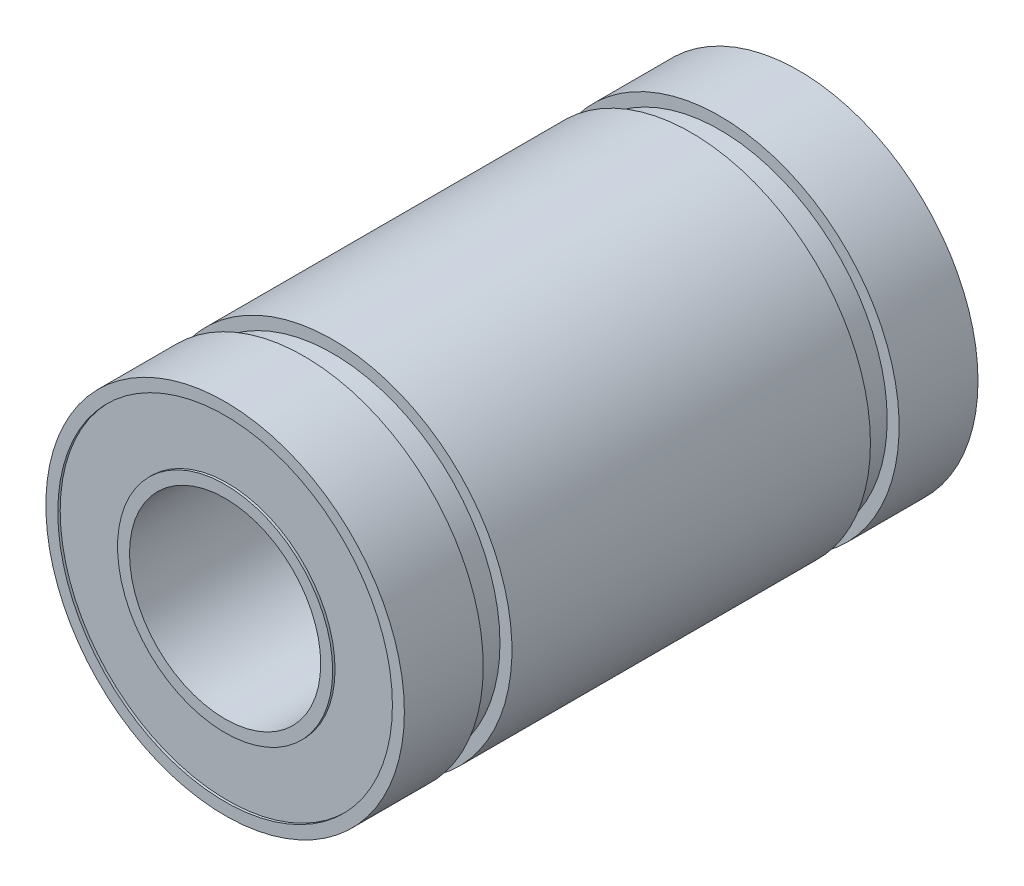
ISO-10303-21;
HEADER;
FILE_DESCRIPTION(('STEP AP214'),'2;1');
FILE_NAME('part.step','',(''),(''),'','','');
FILE_SCHEMA(('AUTOMOTIVE_DESIGN { 1 0 10303 214 1 1 1 1 }'));
ENDSEC;
DATA;
#1=APPLICATION_CONTEXT('core data for automotive mechanical design processes');
#2=APPLICATION_PROTOCOL_DEFINITION('international standard','automotive_design',2000,#1);
#3=PRODUCT_CONTEXT('',#1,'mechanical');
#4=PRODUCT('Part','Part','',(#3));
#5=PRODUCT_RELATED_PRODUCT_CATEGORY('part','',(#4));
#6=PRODUCT_DEFINITION_FORMATION('','',#4);
#7=PRODUCT_DEFINITION_CONTEXT('part definition',#1,'design');
#8=PRODUCT_DEFINITION('design','',#6,#7);
#9=PRODUCT_DEFINITION_SHAPE('','',#8);
#10=(LENGTH_UNIT() NAMED_UNIT(*) SI_UNIT(.MILLI.,.METRE.));
#11=(NAMED_UNIT(*) PLANE_ANGLE_UNIT() SI_UNIT($,.RADIAN.));
#12=(NAMED_UNIT(*) SI_UNIT($,.STERADIAN.) SOLID_ANGLE_UNIT());
#13=UNCERTAINTY_MEASURE_WITH_UNIT(LENGTH_MEASURE(1.E-05),#10,'distance_accuracy_value','');
#14=(GEOMETRIC_REPRESENTATION_CONTEXT(3) GLOBAL_UNCERTAINTY_ASSIGNED_CONTEXT((#13)) GLOBAL_UNIT_ASSIGNED_CONTEXT((#10,
#11,#12)) REPRESENTATION_CONTEXT('',''));
#15=CARTESIAN_POINT('',(0.,0.,0.));
#16=DIRECTION('',(0.,0.,1.));
#17=DIRECTION('',(1.,0.,0.));
#18=AXIS2_PLACEMENT_3D('',#15,#16,#17);
#19=CARTESIAN_POINT('',(0.,0.,12.));
#20=DIRECTION('',(0.,0.,-1.));
#21=DIRECTION('',(-1.,0.,0.));
#22=AXIS2_PLACEMENT_3D('',#19,#20,#21);
#23=CYLINDRICAL_SURFACE('',#22,7.5);
#24=CARTESIAN_POINT('',(0.,0.,-8.7));
#25=DIRECTION('',(0.,0.,-1.));
#26=DIRECTION('',(-1.,0.,0.));
#27=AXIS2_PLACEMENT_3D('',#24,#25,#26);
#28=CIRCLE('',#27,7.5);
#29=CARTESIAN_POINT('',(-7.5,0.,-8.7));
#30=VERTEX_POINT('',#29);
#31=EDGE_CURVE('E41',#30,#30,#28,.T.);
#32=ORIENTED_EDGE('',*,*,#31,.T.);
#33=EDGE_LOOP('',(#32));
#34=FACE_BOUND('',#33,.T.);
#35=CARTESIAN_POINT('',(0.,0.,-12.));
#36=DIRECTION('',(0.,0.,1.));
#37=DIRECTION('',(1.,0.,0.));
#38=AXIS2_PLACEMENT_3D('',#35,#36,#37);
#39=CIRCLE('',#38,7.5);
#40=CARTESIAN_POINT('',(7.5,0.,-12.));
#41=VERTEX_POINT('',#40);
#42=EDGE_CURVE('E45',#41,#41,#39,.T.);
#43=ORIENTED_EDGE('',*,*,#42,.T.);
#44=EDGE_LOOP('',(#43));
#45=FACE_BOUND('',#44,.T.);
#46=ADVANCED_FACE('F37',(#34,#45),#23,.T.);
#47=CARTESIAN_POINT('',(0.,0.,-7.5));
#48=DIRECTION('',(0.,0.,1.));
#49=DIRECTION('',(1.,0.,0.));
#50=AXIS2_PLACEMENT_3D('',#47,#48,#49);
#51=CIRCLE('',#50,7.5);
#52=CARTESIAN_POINT('',(7.5,0.,-7.5));
#53=VERTEX_POINT('',#52);
#54=EDGE_CURVE('E63',#53,#53,#51,.T.);
#55=ORIENTED_EDGE('',*,*,#54,.T.);
#56=EDGE_LOOP('',(#55));
#57=FACE_BOUND('',#56,.T.);
#58=CARTESIAN_POINT('',(0.,0.,7.5));
#59=DIRECTION('',(0.,0.,-1.));
#60=DIRECTION('',(-1.,0.,0.));
#61=AXIS2_PLACEMENT_3D('',#58,#59,#60);
#62=CIRCLE('',#61,7.5);
#63=CARTESIAN_POINT('',(-7.5,0.,7.5));
#64=VERTEX_POINT('',#63);
#65=EDGE_CURVE('E59',#64,#64,#62,.T.);
#66=ORIENTED_EDGE('',*,*,#65,.T.);
#67=EDGE_LOOP('',(#66));
#68=FACE_BOUND('',#67,.T.);
#69=ADVANCED_FACE('F124',(#57,#68),#23,.T.);
#70=CARTESIAN_POINT('',(0.,0.,-12.));
#71=DIRECTION('',(0.,0.,1.));
#72=DIRECTION('',(1.,0.,0.));
#73=AXIS2_PLACEMENT_3D('',#70,#71,#72);
#74=PLANE('',#73);
#75=ORIENTED_EDGE('',*,*,#42,.F.);
#76=EDGE_LOOP('',(#75));
#77=FACE_BOUND('',#76,.T.);
#78=CARTESIAN_POINT('',(0.,0.,-12.));
#79=DIRECTION('',(0.,0.,1.));
#80=DIRECTION('',(1.,0.,0.));
#81=AXIS2_PLACEMENT_3D('',#78,#79,#80);
#82=CIRCLE('',#81,7.);
#83=CARTESIAN_POINT('',(7.,0.,-12.));
#84=VERTEX_POINT('',#83);
#85=EDGE_CURVE('E85',#84,#84,#82,.T.);
#86=ORIENTED_EDGE('',*,*,#85,.T.);
#87=EDGE_LOOP('',(#86));
#88=FACE_BOUND('',#87,.T.);
#89=ADVANCED_FACE('F131',(#77,#88),#74,.F.);
#90=CARTESIAN_POINT('',(0.,0.,12.));
#91=DIRECTION('',(0.,0.,1.));
#92=DIRECTION('',(1.,0.,0.));
#93=AXIS2_PLACEMENT_3D('',#90,#91,#92);
#94=PLANE('',#93);
#95=CARTESIAN_POINT('',(0.,0.,12.));
#96=DIRECTION('',(0.,0.,1.));
#97=DIRECTION('',(1.,0.,0.));
#98=AXIS2_PLACEMENT_3D('',#95,#96,#97);
#99=CIRCLE('',#98,4.);
#100=CARTESIAN_POINT('',(4.,0.,12.));
#101=VERTEX_POINT('',#100);
#102=EDGE_CURVE('E50',#101,#101,#99,.T.);
#103=ORIENTED_EDGE('',*,*,#102,.F.);
#104=EDGE_LOOP('',(#103));
#105=FACE_BOUND('',#104,.T.);
#106=CARTESIAN_POINT('',(0.,0.,12.));
#107=DIRECTION('',(0.,0.,1.));
#108=DIRECTION('',(1.,0.,0.));
#109=AXIS2_PLACEMENT_3D('',#106,#107,#108);
#110=CIRCLE('',#109,4.5);
#111=CARTESIAN_POINT('',(4.5,0.,12.));
#112=VERTEX_POINT('',#111);
#113=EDGE_CURVE('E91',#112,#112,#110,.T.);
#114=ORIENTED_EDGE('',*,*,#113,.T.);
#115=EDGE_LOOP('',(#114));
#116=FACE_BOUND('',#115,.T.);
#117=ADVANCED_FACE('F138',(#105,#116),#94,.T.);
#118=CARTESIAN_POINT('',(0.,0.,12.));
#119=DIRECTION('',(0.,0.,1.));
#120=DIRECTION('',(1.,0.,0.));
#121=AXIS2_PLACEMENT_3D('',#118,#119,#120);
#122=CIRCLE('',#121,7.);
#123=CARTESIAN_POINT('',(7.,0.,12.));
#124=VERTEX_POINT('',#123);
#125=EDGE_CURVE('E97',#124,#124,#122,.T.);
#126=ORIENTED_EDGE('',*,*,#125,.F.);
#127=EDGE_LOOP('',(#126));
#128=FACE_BOUND('',#127,.T.);
#129=CARTESIAN_POINT('',(0.,0.,12.));
#130=DIRECTION('',(0.,0.,1.));
#131=DIRECTION('',(1.,0.,0.));
#132=AXIS2_PLACEMENT_3D('',#129,#130,#131);
#133=CIRCLE('',#132,7.5);
#134=CARTESIAN_POINT('',(7.5,0.,12.));
#135=VERTEX_POINT('',#134);
#136=EDGE_CURVE('E10',#135,#135,#133,.T.);
#137=ORIENTED_EDGE('',*,*,#136,.T.);
#138=EDGE_LOOP('',(#137));
#139=FACE_BOUND('',#138,.T.);
#140=ADVANCED_FACE('F171',(#128,#139),#94,.T.);
#141=CARTESIAN_POINT('',(0.,0.,-12.));
#142=DIRECTION('',(0.,0.,1.));
#143=DIRECTION('',(1.,0.,0.));
#144=AXIS2_PLACEMENT_3D('',#141,#142,#143);
#145=CIRCLE('',#144,4.5);
#146=CARTESIAN_POINT('',(4.5,0.,-12.));
#147=VERTEX_POINT('',#146);
#148=EDGE_CURVE('E62',#147,#147,#145,.T.);
#149=ORIENTED_EDGE('',*,*,#148,.F.);
#150=EDGE_LOOP('',(#149));
#151=FACE_BOUND('',#150,.T.);
#152=CARTESIAN_POINT('',(0.,0.,-12.));
#153=DIRECTION('',(0.,0.,1.));
#154=DIRECTION('',(1.,0.,0.));
#155=AXIS2_PLACEMENT_3D('',#152,#153,#154);
#156=CIRCLE('',#155,4.);
#157=CARTESIAN_POINT('',(4.,0.,-12.));
#158=VERTEX_POINT('',#157);
#159=EDGE_CURVE('E53',#158,#158,#156,.T.);
#160=ORIENTED_EDGE('',*,*,#159,.T.);
#161=EDGE_LOOP('',(#160));
#162=FACE_BOUND('',#161,.T.);
#163=ADVANCED_FACE('F110',(#151,#162),#74,.F.);
#164=CARTESIAN_POINT('',(0.,0.,8.7));
#165=DIRECTION('',(0.,0.,1.));
#166=DIRECTION('',(1.,0.,0.));
#167=AXIS2_PLACEMENT_3D('',#164,#165,#166);
#168=CIRCLE('',#167,7.5);
#169=CARTESIAN_POINT('',(7.5,0.,8.7));
#170=VERTEX_POINT('',#169);
#171=EDGE_CURVE('E56',#170,#170,#168,.T.);
#172=ORIENTED_EDGE('',*,*,#171,.T.);
#173=EDGE_LOOP('',(#172));
#174=FACE_BOUND('',#173,.T.);
#175=ORIENTED_EDGE('',*,*,#136,.F.);
#176=EDGE_LOOP('',(#175));
#177=FACE_BOUND('',#176,.T.);
#178=ADVANCED_FACE('F39',(#174,#177),#23,.T.);
#179=CARTESIAN_POINT('',(0.,0.,12.));
#180=DIRECTION('',(0.,0.,-1.));
#181=DIRECTION('',(-1.,0.,0.));
#182=AXIS2_PLACEMENT_3D('',#179,#180,#181);
#183=CYLINDRICAL_SURFACE('',#182,4.);
#184=ORIENTED_EDGE('',*,*,#102,.T.);
#185=EDGE_LOOP('',(#184));
#186=FACE_BOUND('',#185,.T.);
#187=ORIENTED_EDGE('',*,*,#159,.F.);
#188=EDGE_LOOP('',(#187));
#189=FACE_BOUND('',#188,.T.);
#190=ADVANCED_FACE('F112',(#186,#189),#183,.F.);
#191=CARTESIAN_POINT('',(0.,0.,11.9));
#192=DIRECTION('',(0.,0.,1.));
#193=DIRECTION('',(1.,0.,0.));
#194=AXIS2_PLACEMENT_3D('',#191,#192,#193);
#195=CYLINDRICAL_SURFACE('',#194,7.);
#196=CARTESIAN_POINT('',(0.,0.,11.9));
#197=DIRECTION('',(0.,0.,1.));
#198=DIRECTION('',(1.,0.,0.));
#199=AXIS2_PLACEMENT_3D('',#196,#197,#198);
#200=CIRCLE('',#199,7.);
#201=CARTESIAN_POINT('',(7.,0.,11.9));
#202=VERTEX_POINT('',#201);
#203=EDGE_CURVE('E100',#202,#202,#200,.T.);
#204=ORIENTED_EDGE('',*,*,#203,.F.);
#205=EDGE_LOOP('',(#204));
#206=FACE_BOUND('',#205,.T.);
#207=ORIENTED_EDGE('',*,*,#125,.T.);
#208=EDGE_LOOP('',(#207));
#209=FACE_BOUND('',#208,.T.);
#210=ADVANCED_FACE('F114',(#206,#209),#195,.F.);
#211=CARTESIAN_POINT('',(0.,0.,11.9));
#212=DIRECTION('',(0.,0.,1.));
#213=DIRECTION('',(1.,0.,0.));
#214=AXIS2_PLACEMENT_3D('',#211,#212,#213);
#215=PLANE('',#214);
#216=CARTESIAN_POINT('',(0.,0.,11.9));
#217=DIRECTION('',(0.,0.,1.));
#218=DIRECTION('',(1.,0.,0.));
#219=AXIS2_PLACEMENT_3D('',#216,#217,#218);
#220=CIRCLE('',#219,4.5);
#221=CARTESIAN_POINT('',(4.5,0.,11.9));
#222=VERTEX_POINT('',#221);
#223=EDGE_CURVE('E94',#222,#222,#220,.T.);
#224=ORIENTED_EDGE('',*,*,#223,.F.);
#225=EDGE_LOOP('',(#224));
#226=FACE_BOUND('',#225,.T.);
#227=ORIENTED_EDGE('',*,*,#203,.T.);
#228=EDGE_LOOP('',(#227));
#229=FACE_BOUND('',#228,.T.);
#230=ADVANCED_FACE('F120',(#226,#229),#215,.T.);
#231=CARTESIAN_POINT('',(0.,0.,11.9));
#232=DIRECTION('',(0.,0.,1.));
#233=DIRECTION('',(1.,0.,0.));
#234=AXIS2_PLACEMENT_3D('',#231,#232,#233);
#235=CYLINDRICAL_SURFACE('',#234,4.5);
#236=ORIENTED_EDGE('',*,*,#223,.T.);
#237=EDGE_LOOP('',(#236));
#238=FACE_BOUND('',#237,.T.);
#239=ORIENTED_EDGE('',*,*,#113,.F.);
#240=EDGE_LOOP('',(#239));
#241=FACE_BOUND('',#240,.T.);
#242=ADVANCED_FACE('F154',(#238,#241),#235,.T.);
#243=CARTESIAN_POINT('',(0.,0.,-11.9));
#244=DIRECTION('',(0.,0.,-1.));
#245=DIRECTION('',(1.,0.,0.));
#246=AXIS2_PLACEMENT_3D('',#243,#244,#245);
#247=PLANE('',#246);
#248=CARTESIAN_POINT('',(0.,0.,-11.9));
#249=DIRECTION('',(0.,0.,1.));
#250=DIRECTION('',(1.,0.,0.));
#251=AXIS2_PLACEMENT_3D('',#248,#249,#250);
#252=CIRCLE('',#251,7.);
#253=CARTESIAN_POINT('',(7.,0.,-11.9));
#254=VERTEX_POINT('',#253);
#255=EDGE_CURVE('E88',#254,#254,#252,.T.);
#256=ORIENTED_EDGE('',*,*,#255,.F.);
#257=EDGE_LOOP('',(#256));
#258=FACE_BOUND('',#257,.T.);
#259=CARTESIAN_POINT('',(0.,0.,-11.9));
#260=DIRECTION('',(0.,0.,1.));
#261=DIRECTION('',(1.,0.,0.));
#262=AXIS2_PLACEMENT_3D('',#259,#260,#261);
#263=CIRCLE('',#262,4.5);
#264=CARTESIAN_POINT('',(4.5,0.,-11.9));
#265=VERTEX_POINT('',#264);
#266=EDGE_CURVE('E82',#265,#265,#263,.T.);
#267=ORIENTED_EDGE('',*,*,#266,.T.);
#268=EDGE_LOOP('',(#267));
#269=FACE_BOUND('',#268,.T.);
#270=ADVANCED_FACE('F144',(#258,#269),#247,.T.);
#271=CARTESIAN_POINT('',(0.,0.,-11.9));
#272=DIRECTION('',(0.,0.,-1.));
#273=DIRECTION('',(-1.,0.,0.));
#274=AXIS2_PLACEMENT_3D('',#271,#272,#273);
#275=CYLINDRICAL_SURFACE('',#274,7.);
#276=ORIENTED_EDGE('',*,*,#255,.T.);
#277=EDGE_LOOP('',(#276));
#278=FACE_BOUND('',#277,.T.);
#279=ORIENTED_EDGE('',*,*,#85,.F.);
#280=EDGE_LOOP('',(#279));
#281=FACE_BOUND('',#280,.T.);
#282=ADVANCED_FACE('F141',(#278,#281),#275,.F.);
#283=CARTESIAN_POINT('',(0.,0.,-11.9));
#284=DIRECTION('',(0.,0.,-1.));
#285=DIRECTION('',(-1.,0.,0.));
#286=AXIS2_PLACEMENT_3D('',#283,#284,#285);
#287=CYLINDRICAL_SURFACE('',#286,4.5);
#288=ORIENTED_EDGE('',*,*,#266,.F.);
#289=EDGE_LOOP('',(#288));
#290=FACE_BOUND('',#289,.T.);
#291=ORIENTED_EDGE('',*,*,#148,.T.);
#292=EDGE_LOOP('',(#291));
#293=FACE_BOUND('',#292,.T.);
#294=ADVANCED_FACE('F143',(#290,#293),#287,.T.);
#295=CARTESIAN_POINT('',(0.,8.,7.5));
#296=DIRECTION('',(0.,0.,-1.));
#297=DIRECTION('',(-1.,0.,0.));
#298=AXIS2_PLACEMENT_3D('',#295,#296,#297);
#299=PLANE('',#298);
#300=CARTESIAN_POINT('',(0.,0.,7.5));
#301=DIRECTION('',(0.,0.,-1.));
#302=DIRECTION('',(-1.,0.,0.));
#303=AXIS2_PLACEMENT_3D('',#300,#301,#302);
#304=CIRCLE('',#303,7.);
#305=CARTESIAN_POINT('',(-7.,0.,7.5));
#306=VERTEX_POINT('',#305);
#307=EDGE_CURVE('E69',#306,#306,#304,.T.);
#308=ORIENTED_EDGE('',*,*,#307,.T.);
#309=EDGE_LOOP('',(#308));
#310=FACE_BOUND('',#309,.T.);
#311=ORIENTED_EDGE('',*,*,#65,.F.);
#312=EDGE_LOOP('',(#311));
#313=FACE_BOUND('',#312,.T.);
#314=ADVANCED_FACE('F151',(#310,#313),#299,.F.);
#315=CARTESIAN_POINT('',(0.,8.,8.7));
#316=DIRECTION('',(0.,0.,1.));
#317=DIRECTION('',(1.,0.,0.));
#318=AXIS2_PLACEMENT_3D('',#315,#316,#317);
#319=PLANE('',#318);
#320=CARTESIAN_POINT('',(0.,0.,8.7));
#321=DIRECTION('',(0.,0.,-1.));
#322=DIRECTION('',(-1.,0.,0.));
#323=AXIS2_PLACEMENT_3D('',#320,#321,#322);
#324=CIRCLE('',#323,7.);
#325=CARTESIAN_POINT('',(-7.,0.,8.7));
#326=VERTEX_POINT('',#325);
#327=EDGE_CURVE('E60',#326,#326,#324,.T.);
#328=ORIENTED_EDGE('',*,*,#327,.F.);
#329=EDGE_LOOP('',(#328));
#330=FACE_BOUND('',#329,.T.);
#331=ORIENTED_EDGE('',*,*,#171,.F.);
#332=EDGE_LOOP('',(#331));
#333=FACE_BOUND('',#332,.T.);
#334=ADVANCED_FACE('F215',(#330,#333),#319,.F.);
#335=CARTESIAN_POINT('',(0.,0.,0.));
#336=DIRECTION('',(0.,0.,-1.));
#337=DIRECTION('',(-1.,0.,0.));
#338=AXIS2_PLACEMENT_3D('',#335,#336,#337);
#339=CYLINDRICAL_SURFACE('',#338,7.);
#340=ORIENTED_EDGE('',*,*,#307,.F.);
#341=EDGE_LOOP('',(#340));
#342=FACE_BOUND('',#341,.T.);
#343=ORIENTED_EDGE('',*,*,#327,.T.);
#344=EDGE_LOOP('',(#343));
#345=FACE_BOUND('',#344,.T.);
#346=ADVANCED_FACE('F225',(#342,#345),#339,.T.);
#347=CARTESIAN_POINT('',(0.,8.,-8.7));
#348=DIRECTION('',(0.,0.,-1.));
#349=DIRECTION('',(-1.,0.,0.));
#350=AXIS2_PLACEMENT_3D('',#347,#348,#349);
#351=PLANE('',#350);
#352=CARTESIAN_POINT('',(0.,0.,-8.7));
#353=DIRECTION('',(0.,0.,-1.));
#354=DIRECTION('',(-1.,0.,0.));
#355=AXIS2_PLACEMENT_3D('',#352,#353,#354);
#356=CIRCLE('',#355,7.);
#357=CARTESIAN_POINT('',(-7.,0.,-8.7));
#358=VERTEX_POINT('',#357);
#359=EDGE_CURVE('E65',#358,#358,#356,.T.);
#360=ORIENTED_EDGE('',*,*,#359,.T.);
#361=EDGE_LOOP('',(#360));
#362=FACE_BOUND('',#361,.T.);
#363=ORIENTED_EDGE('',*,*,#31,.F.);
#364=EDGE_LOOP('',(#363));
#365=FACE_BOUND('',#364,.T.);
#366=ADVANCED_FACE('F235',(#362,#365),#351,.F.);
#367=CARTESIAN_POINT('',(0.,8.,-7.5));
#368=DIRECTION('',(0.,0.,1.));
#369=DIRECTION('',(1.,0.,0.));
#370=AXIS2_PLACEMENT_3D('',#367,#368,#369);
#371=PLANE('',#370);
#372=CARTESIAN_POINT('',(0.,0.,-7.5));
#373=DIRECTION('',(0.,0.,-1.));
#374=DIRECTION('',(-1.,0.,0.));
#375=AXIS2_PLACEMENT_3D('',#372,#373,#374);
#376=CIRCLE('',#375,7.);
#377=CARTESIAN_POINT('',(-7.,0.,-7.5));
#378=VERTEX_POINT('',#377);
#379=EDGE_CURVE('E71',#378,#378,#376,.T.);
#380=ORIENTED_EDGE('',*,*,#379,.F.);
#381=EDGE_LOOP('',(#380));
#382=FACE_BOUND('',#381,.T.);
#383=ORIENTED_EDGE('',*,*,#54,.F.);
#384=EDGE_LOOP('',(#383));
#385=FACE_BOUND('',#384,.T.);
#386=ADVANCED_FACE('F245',(#382,#385),#371,.F.);
#387=CARTESIAN_POINT('',(0.,0.,0.));
#388=DIRECTION('',(0.,0.,-1.));
#389=DIRECTION('',(-1.,0.,0.));
#390=AXIS2_PLACEMENT_3D('',#387,#388,#389);
#391=CYLINDRICAL_SURFACE('',#390,7.);
#392=ORIENTED_EDGE('',*,*,#359,.F.);
#393=EDGE_LOOP('',(#392));
#394=FACE_BOUND('',#393,.T.);
#395=ORIENTED_EDGE('',*,*,#379,.T.);
#396=EDGE_LOOP('',(#395));
#397=FACE_BOUND('',#396,.T.);
#398=ADVANCED_FACE('F254',(#394,#397),#391,.T.);
#399=CLOSED_SHELL('',(#46,#69,#89,#117,#140,#163,#178,#190,#210,#230,#242,#270,#282,#294,#314,
#334,#346,#366,#386,#398));
#400=MANIFOLD_SOLID_BREP('B2',#399);
#401=ADVANCED_BREP_SHAPE_REPRESENTATION('',(#18,#400),#14);
#402=SHAPE_DEFINITION_REPRESENTATION(#9,#401);
ENDSEC;
END-ISO-10303-21;
